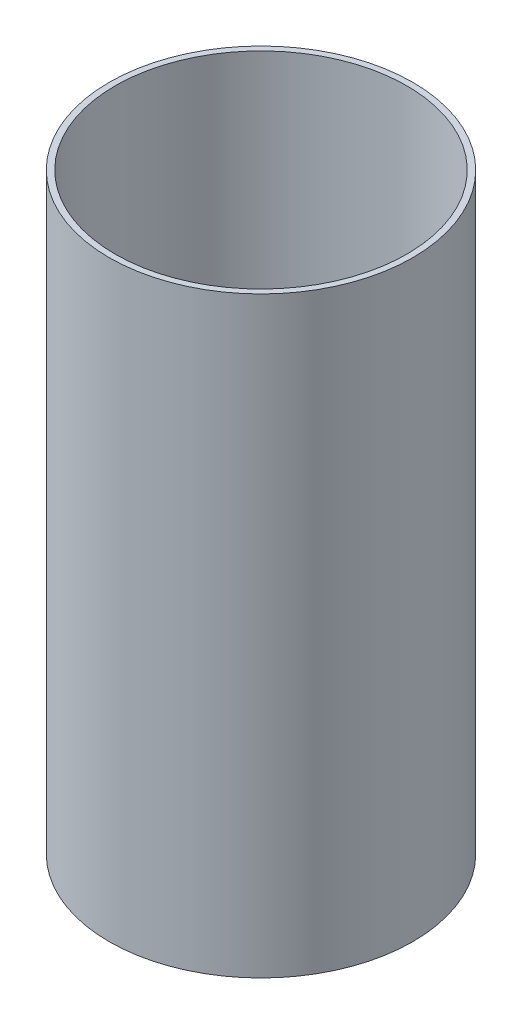
ISO-10303-21;
HEADER;
FILE_DESCRIPTION(('STEP AP214'),'2;1');
FILE_NAME('part.step','',(''),(''),'','','');
FILE_SCHEMA(('AUTOMOTIVE_DESIGN { 1 0 10303 214 1 1 1 1 }'));
ENDSEC;
DATA;
#1=APPLICATION_CONTEXT('core data for automotive mechanical design processes');
#2=APPLICATION_PROTOCOL_DEFINITION('international standard','automotive_design',2000,#1);
#3=PRODUCT_CONTEXT('',#1,'mechanical');
#4=PRODUCT('Part','Part','',(#3));
#5=PRODUCT_RELATED_PRODUCT_CATEGORY('part','',(#4));
#6=PRODUCT_DEFINITION_FORMATION('','',#4);
#7=PRODUCT_DEFINITION_CONTEXT('part definition',#1,'design');
#8=PRODUCT_DEFINITION('design','',#6,#7);
#9=PRODUCT_DEFINITION_SHAPE('','',#8);
#10=(LENGTH_UNIT() NAMED_UNIT(*) SI_UNIT(.MILLI.,.METRE.));
#11=(NAMED_UNIT(*) PLANE_ANGLE_UNIT() SI_UNIT($,.RADIAN.));
#12=(NAMED_UNIT(*) SI_UNIT($,.STERADIAN.) SOLID_ANGLE_UNIT());
#13=UNCERTAINTY_MEASURE_WITH_UNIT(LENGTH_MEASURE(1.E-05),#10,'distance_accuracy_value','');
#14=(GEOMETRIC_REPRESENTATION_CONTEXT(3) GLOBAL_UNCERTAINTY_ASSIGNED_CONTEXT((#13)) GLOBAL_UNIT_ASSIGNED_CONTEXT((#10,
#11,#12)) REPRESENTATION_CONTEXT('',''));
#15=CARTESIAN_POINT('',(0.,0.,0.));
#16=DIRECTION('',(0.,0.,1.));
#17=DIRECTION('',(1.,0.,0.));
#18=AXIS2_PLACEMENT_3D('',#15,#16,#17);
#19=CARTESIAN_POINT('',(0.,296.5,0.));
#20=DIRECTION('',(0.,1.,0.));
#21=DIRECTION('',(0.,0.,1.));
#22=AXIS2_PLACEMENT_3D('',#19,#20,#21);
#23=PLANE('',#22);
#24=CARTESIAN_POINT('',(0.,296.5,0.));
#25=DIRECTION('',(0.,1.,0.));
#26=DIRECTION('',(0.,0.,1.));
#27=AXIS2_PLACEMENT_3D('',#24,#25,#26);
#28=CIRCLE('',#27,76.);
#29=CARTESIAN_POINT('',(0.,296.5,76.));
#30=VERTEX_POINT('',#29);
#31=EDGE_CURVE('E10',#30,#30,#28,.T.);
#32=ORIENTED_EDGE('',*,*,#31,.T.);
#33=EDGE_LOOP('',(#32));
#34=FACE_BOUND('',#33,.T.);
#35=CARTESIAN_POINT('',(0.,296.5,0.));
#36=DIRECTION('',(0.,1.,0.));
#37=DIRECTION('',(0.,0.,1.));
#38=AXIS2_PLACEMENT_3D('',#35,#36,#37);
#39=CIRCLE('',#38,73.);
#40=CARTESIAN_POINT('',(0.,296.5,73.));
#41=VERTEX_POINT('',#40);
#42=EDGE_CURVE('E54',#41,#41,#39,.T.);
#43=ORIENTED_EDGE('',*,*,#42,.F.);
#44=EDGE_LOOP('',(#43));
#45=FACE_BOUND('',#44,.T.);
#46=ADVANCED_FACE('F40',(#34,#45),#23,.T.);
#47=CARTESIAN_POINT('',(0.,0.,0.));
#48=DIRECTION('',(0.,1.,0.));
#49=DIRECTION('',(0.,0.,1.));
#50=AXIS2_PLACEMENT_3D('',#47,#48,#49);
#51=PLANE('',#50);
#52=CARTESIAN_POINT('',(0.,0.,0.));
#53=DIRECTION('',(0.,1.,0.));
#54=DIRECTION('',(0.,0.,1.));
#55=AXIS2_PLACEMENT_3D('',#52,#53,#54);
#56=CIRCLE('',#55,76.);
#57=CARTESIAN_POINT('',(0.,0.,76.));
#58=VERTEX_POINT('',#57);
#59=EDGE_CURVE('E44',#58,#58,#56,.T.);
#60=ORIENTED_EDGE('',*,*,#59,.F.);
#61=EDGE_LOOP('',(#60));
#62=FACE_BOUND('',#61,.T.);
#63=CARTESIAN_POINT('',(0.,0.,0.));
#64=DIRECTION('',(0.,1.,0.));
#65=DIRECTION('',(0.,0.,1.));
#66=AXIS2_PLACEMENT_3D('',#63,#64,#65);
#67=CIRCLE('',#66,73.);
#68=CARTESIAN_POINT('',(0.,0.,73.));
#69=VERTEX_POINT('',#68);
#70=EDGE_CURVE('E56',#69,#69,#67,.T.);
#71=ORIENTED_EDGE('',*,*,#70,.T.);
#72=EDGE_LOOP('',(#71));
#73=FACE_BOUND('',#72,.T.);
#74=ADVANCED_FACE('F69',(#62,#73),#51,.F.);
#75=CARTESIAN_POINT('',(0.,296.5,0.));
#76=DIRECTION('',(0.,-1.,0.));
#77=DIRECTION('',(0.,0.,-1.));
#78=AXIS2_PLACEMENT_3D('',#75,#76,#77);
#79=CYLINDRICAL_SURFACE('',#78,76.);
#80=ORIENTED_EDGE('',*,*,#31,.F.);
#81=EDGE_LOOP('',(#80));
#82=FACE_BOUND('',#81,.T.);
#83=ORIENTED_EDGE('',*,*,#59,.T.);
#84=EDGE_LOOP('',(#83));
#85=FACE_BOUND('',#84,.T.);
#86=ADVANCED_FACE('F42',(#82,#85),#79,.T.);
#87=CARTESIAN_POINT('',(0.,296.5,0.));
#88=DIRECTION('',(0.,-1.,0.));
#89=DIRECTION('',(0.,0.,-1.));
#90=AXIS2_PLACEMENT_3D('',#87,#88,#89);
#91=CYLINDRICAL_SURFACE('',#90,73.);
#92=ORIENTED_EDGE('',*,*,#42,.T.);
#93=EDGE_LOOP('',(#92));
#94=FACE_BOUND('',#93,.T.);
#95=ORIENTED_EDGE('',*,*,#70,.F.);
#96=EDGE_LOOP('',(#95));
#97=FACE_BOUND('',#96,.T.);
#98=ADVANCED_FACE('F65',(#94,#97),#91,.F.);
#99=CLOSED_SHELL('',(#46,#74,#86,#98));
#100=MANIFOLD_SOLID_BREP('B2',#99);
#101=ADVANCED_BREP_SHAPE_REPRESENTATION('',(#18,#100),#14);
#102=SHAPE_DEFINITION_REPRESENTATION(#9,#101);
ENDSEC;
END-ISO-10303-21;
